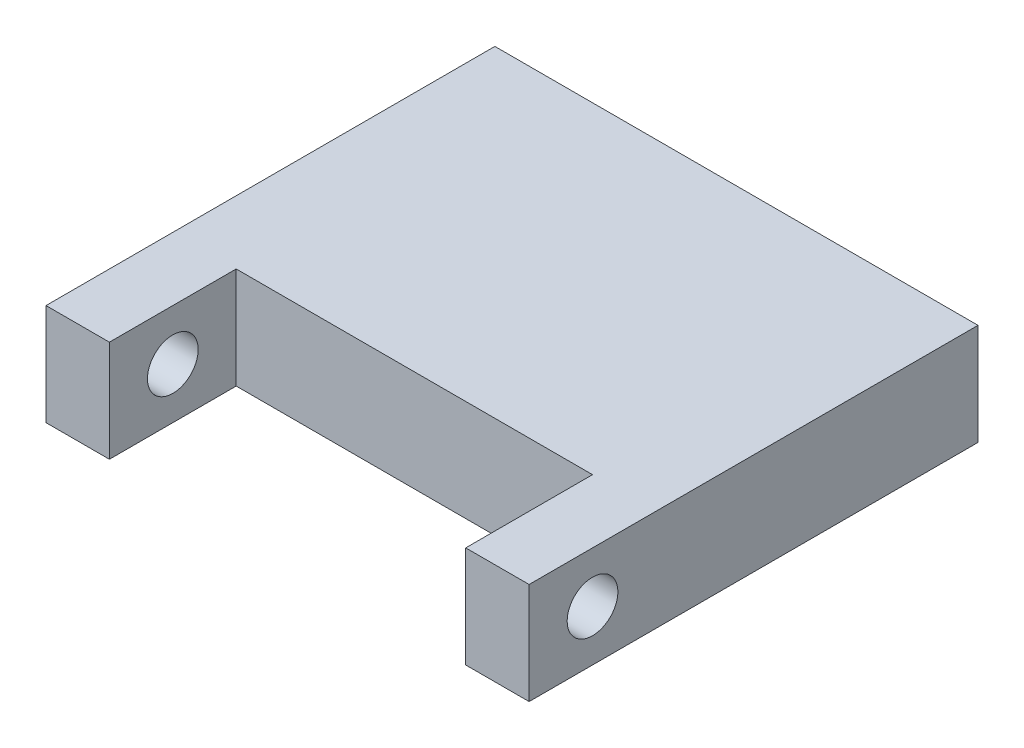
ISO-10303-21;
HEADER;
FILE_DESCRIPTION(('STEP AP214'),'2;1');
FILE_NAME('part.step','',(''),(''),'','','');
FILE_SCHEMA(('AUTOMOTIVE_DESIGN { 1 0 10303 214 1 1 1 1 }'));
ENDSEC;
DATA;
#1=APPLICATION_CONTEXT('core data for automotive mechanical design processes');
#2=APPLICATION_PROTOCOL_DEFINITION('international standard','automotive_design',2000,#1);
#3=PRODUCT_CONTEXT('',#1,'mechanical');
#4=PRODUCT('Part','Part','',(#3));
#5=PRODUCT_RELATED_PRODUCT_CATEGORY('part','',(#4));
#6=PRODUCT_DEFINITION_FORMATION('','',#4);
#7=PRODUCT_DEFINITION_CONTEXT('part definition',#1,'design');
#8=PRODUCT_DEFINITION('design','',#6,#7);
#9=PRODUCT_DEFINITION_SHAPE('','',#8);
#10=(LENGTH_UNIT() NAMED_UNIT(*) SI_UNIT(.MILLI.,.METRE.));
#11=(NAMED_UNIT(*) PLANE_ANGLE_UNIT() SI_UNIT($,.RADIAN.));
#12=(NAMED_UNIT(*) SI_UNIT($,.STERADIAN.) SOLID_ANGLE_UNIT());
#13=UNCERTAINTY_MEASURE_WITH_UNIT(LENGTH_MEASURE(1.E-05),#10,'distance_accuracy_value','');
#14=(GEOMETRIC_REPRESENTATION_CONTEXT(3) GLOBAL_UNCERTAINTY_ASSIGNED_CONTEXT((#13)) GLOBAL_UNIT_ASSIGNED_CONTEXT((#10,
#11,#12)) REPRESENTATION_CONTEXT('',''));
#15=CARTESIAN_POINT('',(0.,0.,0.));
#16=DIRECTION('',(0.,0.,1.));
#17=DIRECTION('',(1.,0.,0.));
#18=AXIS2_PLACEMENT_3D('',#15,#16,#17);
#19=CARTESIAN_POINT('',(0.,8.,0.));
#20=DIRECTION('',(0.,0.,-1.));
#21=DIRECTION('',(-1.,0.,0.));
#22=AXIS2_PLACEMENT_3D('',#19,#20,#21);
#23=PLANE('',#22);
#24=DIRECTION('',(0.,1.,0.));
#25=VECTOR('',#24,1.);
#26=CARTESIAN_POINT('',(5.,0.,0.));
#27=LINE('',#26,#25);
#28=CARTESIAN_POINT('',(5.,0.,0.));
#29=VERTEX_POINT('',#28);
#30=CARTESIAN_POINT('',(5.,8.,0.));
#31=VERTEX_POINT('',#30);
#32=EDGE_CURVE('E118',#29,#31,#27,.T.);
#33=ORIENTED_EDGE('',*,*,#32,.F.);
#34=DIRECTION('',(1.,0.,0.));
#35=VECTOR('',#34,1.);
#36=CARTESIAN_POINT('',(0.,0.,0.));
#37=LINE('',#36,#35);
#38=CARTESIAN_POINT('',(33.1,0.,0.));
#39=VERTEX_POINT('',#38);
#40=EDGE_CURVE('E160',#29,#39,#37,.T.);
#41=ORIENTED_EDGE('',*,*,#40,.T.);
#42=DIRECTION('',(0.,-1.,0.));
#43=VECTOR('',#42,1.);
#44=CARTESIAN_POINT('',(33.1,0.,0.));
#45=LINE('',#44,#43);
#46=CARTESIAN_POINT('',(33.1,8.,0.));
#47=VERTEX_POINT('',#46);
#48=EDGE_CURVE('E132',#47,#39,#45,.T.);
#49=ORIENTED_EDGE('',*,*,#48,.F.);
#50=DIRECTION('',(1.,0.,0.));
#51=VECTOR('',#50,1.);
#52=CARTESIAN_POINT('',(0.,8.,0.));
#53=LINE('',#52,#51);
#54=EDGE_CURVE('E50',#31,#47,#53,.T.);
#55=ORIENTED_EDGE('',*,*,#54,.F.);
#56=EDGE_LOOP('',(#33,#41,#49,#55));
#57=FACE_BOUND('',#56,.T.);
#58=ADVANCED_FACE('F34',(#57),#23,.F.);
#59=CARTESIAN_POINT('',(0.,8.,0.));
#60=DIRECTION('',(1.,0.,0.));
#61=DIRECTION('',(0.,0.,-1.));
#62=AXIS2_PLACEMENT_3D('',#59,#60,#61);
#63=PLANE('',#62);
#64=CARTESIAN_POINT('',(0.,4.,5.));
#65=DIRECTION('',(-1.,0.,0.));
#66=DIRECTION('',(0.,0.,1.));
#67=AXIS2_PLACEMENT_3D('',#64,#65,#66);
#68=CIRCLE('',#67,2.);
#69=CARTESIAN_POINT('',(0.,4.,7.));
#70=VERTEX_POINT('',#69);
#71=EDGE_CURVE('E177',#70,#70,#68,.T.);
#72=ORIENTED_EDGE('',*,*,#71,.F.);
#73=EDGE_LOOP('',(#72));
#74=FACE_BOUND('',#73,.T.);
#75=DIRECTION('',(0.,0.,1.));
#76=VECTOR('',#75,1.);
#77=CARTESIAN_POINT('',(0.,0.,0.));
#78=LINE('',#77,#76);
#79=CARTESIAN_POINT('',(0.,0.,-25.4));
#80=VERTEX_POINT('',#79);
#81=CARTESIAN_POINT('',(0.,0.,10.));
#82=VERTEX_POINT('',#81);
#83=EDGE_CURVE('E151',#80,#82,#78,.T.);
#84=ORIENTED_EDGE('',*,*,#83,.T.);
#85=DIRECTION('',(0.,-1.,0.));
#86=VECTOR('',#85,1.);
#87=CARTESIAN_POINT('',(0.,0.,10.));
#88=LINE('',#87,#86);
#89=CARTESIAN_POINT('',(0.,8.,10.));
#90=VERTEX_POINT('',#89);
#91=EDGE_CURVE('E108',#90,#82,#88,.T.);
#92=ORIENTED_EDGE('',*,*,#91,.F.);
#93=DIRECTION('',(0.,0.,1.));
#94=VECTOR('',#93,1.);
#95=CARTESIAN_POINT('',(0.,8.,0.));
#96=LINE('',#95,#94);
#97=CARTESIAN_POINT('',(0.,8.,-25.4));
#98=VERTEX_POINT('',#97);
#99=EDGE_CURVE('E104',#98,#90,#96,.T.);
#100=ORIENTED_EDGE('',*,*,#99,.F.);
#101=DIRECTION('',(0.,-1.,0.));
#102=VECTOR('',#101,1.);
#103=CARTESIAN_POINT('',(0.,8.,-25.4));
#104=LINE('',#103,#102);
#105=EDGE_CURVE('E43',#98,#80,#104,.T.);
#106=ORIENTED_EDGE('',*,*,#105,.T.);
#107=EDGE_LOOP('',(#84,#92,#100,#106));
#108=FACE_BOUND('',#107,.T.);
#109=ADVANCED_FACE('F36',(#74,#108),#63,.F.);
#110=CARTESIAN_POINT('',(38.1,8.,0.));
#111=DIRECTION('',(-1.,0.,0.));
#112=DIRECTION('',(0.,0.,1.));
#113=AXIS2_PLACEMENT_3D('',#110,#111,#112);
#114=PLANE('',#113);
#115=CARTESIAN_POINT('',(38.1,4.,5.));
#116=DIRECTION('',(-1.,0.,0.));
#117=DIRECTION('',(0.,0.,1.));
#118=AXIS2_PLACEMENT_3D('',#115,#116,#117);
#119=CIRCLE('',#118,2.);
#120=CARTESIAN_POINT('',(38.1,4.,7.));
#121=VERTEX_POINT('',#120);
#122=EDGE_CURVE('E125',#121,#121,#119,.T.);
#123=ORIENTED_EDGE('',*,*,#122,.T.);
#124=EDGE_LOOP('',(#123));
#125=FACE_BOUND('',#124,.T.);
#126=DIRECTION('',(0.,0.,-1.));
#127=VECTOR('',#126,1.);
#128=CARTESIAN_POINT('',(38.1,0.,0.));
#129=LINE('',#128,#127);
#130=CARTESIAN_POINT('',(38.1,0.,10.));
#131=VERTEX_POINT('',#130);
#132=CARTESIAN_POINT('',(38.1,0.,-25.4));
#133=VERTEX_POINT('',#132);
#134=EDGE_CURVE('E162',#131,#133,#129,.T.);
#135=ORIENTED_EDGE('',*,*,#134,.T.);
#136=DIRECTION('',(0.,-1.,0.));
#137=VECTOR('',#136,1.);
#138=CARTESIAN_POINT('',(38.1,8.,-25.4));
#139=LINE('',#138,#137);
#140=CARTESIAN_POINT('',(38.1,8.,-25.4));
#141=VERTEX_POINT('',#140);
#142=EDGE_CURVE('E11',#141,#133,#139,.T.);
#143=ORIENTED_EDGE('',*,*,#142,.F.);
#144=DIRECTION('',(0.,0.,-1.));
#145=VECTOR('',#144,1.);
#146=CARTESIAN_POINT('',(38.1,8.,0.));
#147=LINE('',#146,#145);
#148=CARTESIAN_POINT('',(38.1,8.,10.));
#149=VERTEX_POINT('',#148);
#150=EDGE_CURVE('E155',#149,#141,#147,.T.);
#151=ORIENTED_EDGE('',*,*,#150,.F.);
#152=DIRECTION('',(0.,1.,0.));
#153=VECTOR('',#152,1.);
#154=CARTESIAN_POINT('',(38.1,0.,10.));
#155=LINE('',#154,#153);
#156=EDGE_CURVE('E133',#131,#149,#155,.T.);
#157=ORIENTED_EDGE('',*,*,#156,.F.);
#158=EDGE_LOOP('',(#135,#143,#151,#157));
#159=FACE_BOUND('',#158,.T.);
#160=ADVANCED_FACE('F188',(#125,#159),#114,.F.);
#161=CARTESIAN_POINT('',(0.,8.,-25.4));
#162=DIRECTION('',(0.,0.,1.));
#163=DIRECTION('',(1.,0.,0.));
#164=AXIS2_PLACEMENT_3D('',#161,#162,#163);
#165=PLANE('',#164);
#166=DIRECTION('',(-1.,0.,0.));
#167=VECTOR('',#166,1.);
#168=CARTESIAN_POINT('',(0.,0.,-25.4));
#169=LINE('',#168,#167);
#170=EDGE_CURVE('E153',#133,#80,#169,.T.);
#171=ORIENTED_EDGE('',*,*,#170,.T.);
#172=ORIENTED_EDGE('',*,*,#105,.F.);
#173=DIRECTION('',(-1.,0.,0.));
#174=VECTOR('',#173,1.);
#175=CARTESIAN_POINT('',(0.,8.,-25.4));
#176=LINE('',#175,#174);
#177=EDGE_CURVE('E157',#141,#98,#176,.T.);
#178=ORIENTED_EDGE('',*,*,#177,.F.);
#179=ORIENTED_EDGE('',*,*,#142,.T.);
#180=EDGE_LOOP('',(#171,#172,#178,#179));
#181=FACE_BOUND('',#180,.T.);
#182=ADVANCED_FACE('F193',(#181),#165,.F.);
#183=CARTESIAN_POINT('',(0.,8.,0.));
#184=DIRECTION('',(0.,-1.,0.));
#185=DIRECTION('',(0.,0.,-1.));
#186=AXIS2_PLACEMENT_3D('',#183,#184,#185);
#187=PLANE('',#186);
#188=ORIENTED_EDGE('',*,*,#99,.T.);
#189=DIRECTION('',(-1.,0.,0.));
#190=VECTOR('',#189,1.);
#191=CARTESIAN_POINT('',(5.,8.,10.));
#192=LINE('',#191,#190);
#193=CARTESIAN_POINT('',(5.,8.,10.));
#194=VERTEX_POINT('',#193);
#195=EDGE_CURVE('E97',#194,#90,#192,.T.);
#196=ORIENTED_EDGE('',*,*,#195,.F.);
#197=DIRECTION('',(0.,0.,-1.));
#198=VECTOR('',#197,1.);
#199=CARTESIAN_POINT('',(5.,8.,10.));
#200=LINE('',#199,#198);
#201=EDGE_CURVE('E101',#194,#31,#200,.T.);
#202=ORIENTED_EDGE('',*,*,#201,.T.);
#203=ORIENTED_EDGE('',*,*,#54,.T.);
#204=DIRECTION('',(0.,0.,-1.));
#205=VECTOR('',#204,1.);
#206=CARTESIAN_POINT('',(33.1,8.,10.));
#207=LINE('',#206,#205);
#208=CARTESIAN_POINT('',(33.1,8.,10.));
#209=VERTEX_POINT('',#208);
#210=EDGE_CURVE('E148',#209,#47,#207,.T.);
#211=ORIENTED_EDGE('',*,*,#210,.F.);
#212=DIRECTION('',(-1.,0.,0.));
#213=VECTOR('',#212,1.);
#214=CARTESIAN_POINT('',(38.1,8.,10.));
#215=LINE('',#214,#213);
#216=EDGE_CURVE('E136',#149,#209,#215,.T.);
#217=ORIENTED_EDGE('',*,*,#216,.F.);
#218=ORIENTED_EDGE('',*,*,#150,.T.);
#219=ORIENTED_EDGE('',*,*,#177,.T.);
#220=EDGE_LOOP('',(#188,#196,#202,#203,#211,#217,#218,#219));
#221=FACE_BOUND('',#220,.T.);
#222=ADVANCED_FACE('F99',(#221),#187,.F.);
#223=CARTESIAN_POINT('',(0.,0.,0.));
#224=DIRECTION('',(0.,-1.,0.));
#225=DIRECTION('',(0.,0.,-1.));
#226=AXIS2_PLACEMENT_3D('',#223,#224,#225);
#227=PLANE('',#226);
#228=ORIENTED_EDGE('',*,*,#83,.F.);
#229=ORIENTED_EDGE('',*,*,#170,.F.);
#230=ORIENTED_EDGE('',*,*,#134,.F.);
#231=DIRECTION('',(1.,0.,0.));
#232=VECTOR('',#231,1.);
#233=CARTESIAN_POINT('',(38.1,0.,10.));
#234=LINE('',#233,#232);
#235=CARTESIAN_POINT('',(33.1,0.,10.));
#236=VERTEX_POINT('',#235);
#237=EDGE_CURVE('E140',#236,#131,#234,.T.);
#238=ORIENTED_EDGE('',*,*,#237,.F.);
#239=DIRECTION('',(0.,0.,-1.));
#240=VECTOR('',#239,1.);
#241=CARTESIAN_POINT('',(33.1,0.,10.));
#242=LINE('',#241,#240);
#243=EDGE_CURVE('E143',#236,#39,#242,.T.);
#244=ORIENTED_EDGE('',*,*,#243,.T.);
#245=ORIENTED_EDGE('',*,*,#40,.F.);
#246=DIRECTION('',(0.,0.,-1.));
#247=VECTOR('',#246,1.);
#248=CARTESIAN_POINT('',(5.,0.,10.));
#249=LINE('',#248,#247);
#250=CARTESIAN_POINT('',(5.,0.,10.));
#251=VERTEX_POINT('',#250);
#252=EDGE_CURVE('E122',#251,#29,#249,.T.);
#253=ORIENTED_EDGE('',*,*,#252,.F.);
#254=DIRECTION('',(1.,0.,0.));
#255=VECTOR('',#254,1.);
#256=CARTESIAN_POINT('',(5.,0.,10.));
#257=LINE('',#256,#255);
#258=EDGE_CURVE('E114',#82,#251,#257,.T.);
#259=ORIENTED_EDGE('',*,*,#258,.F.);
#260=EDGE_LOOP('',(#228,#229,#230,#238,#244,#245,#253,#259));
#261=FACE_BOUND('',#260,.T.);
#262=ADVANCED_FACE('F173',(#261),#227,.T.);
#263=CARTESIAN_POINT('',(33.1,0.,10.));
#264=DIRECTION('',(1.,0.,0.));
#265=DIRECTION('',(0.,0.,-1.));
#266=AXIS2_PLACEMENT_3D('',#263,#264,#265);
#267=PLANE('',#266);
#268=CARTESIAN_POINT('',(33.1,4.,5.));
#269=DIRECTION('',(-1.,0.,0.));
#270=DIRECTION('',(0.,0.,1.));
#271=AXIS2_PLACEMENT_3D('',#268,#269,#270);
#272=CIRCLE('',#271,2.);
#273=CARTESIAN_POINT('',(33.1,4.,7.));
#274=VERTEX_POINT('',#273);
#275=EDGE_CURVE('E121',#274,#274,#272,.T.);
#276=ORIENTED_EDGE('',*,*,#275,.F.);
#277=EDGE_LOOP('',(#276));
#278=FACE_BOUND('',#277,.T.);
#279=ORIENTED_EDGE('',*,*,#48,.T.);
#280=ORIENTED_EDGE('',*,*,#243,.F.);
#281=DIRECTION('',(0.,-1.,0.));
#282=VECTOR('',#281,1.);
#283=CARTESIAN_POINT('',(33.1,0.,10.));
#284=LINE('',#283,#282);
#285=EDGE_CURVE('E138',#209,#236,#284,.T.);
#286=ORIENTED_EDGE('',*,*,#285,.F.);
#287=ORIENTED_EDGE('',*,*,#210,.T.);
#288=EDGE_LOOP('',(#279,#280,#286,#287));
#289=FACE_BOUND('',#288,.T.);
#290=ADVANCED_FACE('F203',(#278,#289),#267,.F.);
#291=CARTESIAN_POINT('',(0.,0.,10.));
#292=DIRECTION('',(0.,0.,1.));
#293=DIRECTION('',(1.,0.,0.));
#294=AXIS2_PLACEMENT_3D('',#291,#292,#293);
#295=PLANE('',#294);
#296=ORIENTED_EDGE('',*,*,#156,.T.);
#297=ORIENTED_EDGE('',*,*,#216,.T.);
#298=ORIENTED_EDGE('',*,*,#285,.T.);
#299=ORIENTED_EDGE('',*,*,#237,.T.);
#300=EDGE_LOOP('',(#296,#297,#298,#299));
#301=FACE_BOUND('',#300,.T.);
#302=ADVANCED_FACE('F208',(#301),#295,.T.);
#303=CARTESIAN_POINT('',(63.1,4.,5.));
#304=DIRECTION('',(-1.,0.,0.));
#305=DIRECTION('',(0.,0.,1.));
#306=AXIS2_PLACEMENT_3D('',#303,#304,#305);
#307=CYLINDRICAL_SURFACE('',#306,2.);
#308=ORIENTED_EDGE('',*,*,#275,.T.);
#309=EDGE_LOOP('',(#308));
#310=FACE_BOUND('',#309,.T.);
#311=ORIENTED_EDGE('',*,*,#122,.F.);
#312=EDGE_LOOP('',(#311));
#313=FACE_BOUND('',#312,.T.);
#314=ADVANCED_FACE('F212',(#310,#313),#307,.F.);
#315=CARTESIAN_POINT('',(5.,0.,10.));
#316=DIRECTION('',(-1.,0.,0.));
#317=DIRECTION('',(0.,0.,1.));
#318=AXIS2_PLACEMENT_3D('',#315,#316,#317);
#319=PLANE('',#318);
#320=CARTESIAN_POINT('',(5.,4.,5.));
#321=DIRECTION('',(-1.,0.,0.));
#322=DIRECTION('',(0.,0.,1.));
#323=AXIS2_PLACEMENT_3D('',#320,#321,#322);
#324=CIRCLE('',#323,2.);
#325=CARTESIAN_POINT('',(5.,4.,7.));
#326=VERTEX_POINT('',#325);
#327=EDGE_CURVE('E38',#326,#326,#324,.T.);
#328=ORIENTED_EDGE('',*,*,#327,.T.);
#329=EDGE_LOOP('',(#328));
#330=FACE_BOUND('',#329,.T.);
#331=ORIENTED_EDGE('',*,*,#32,.T.);
#332=ORIENTED_EDGE('',*,*,#201,.F.);
#333=DIRECTION('',(0.,1.,0.));
#334=VECTOR('',#333,1.);
#335=CARTESIAN_POINT('',(5.,0.,10.));
#336=LINE('',#335,#334);
#337=EDGE_CURVE('E109',#251,#194,#336,.T.);
#338=ORIENTED_EDGE('',*,*,#337,.F.);
#339=ORIENTED_EDGE('',*,*,#252,.T.);
#340=EDGE_LOOP('',(#331,#332,#338,#339));
#341=FACE_BOUND('',#340,.T.);
#342=ADVANCED_FACE('F120',(#330,#341),#319,.F.);
#343=CARTESIAN_POINT('',(-33.1,0.,10.));
#344=DIRECTION('',(0.,0.,1.));
#345=DIRECTION('',(1.,0.,0.));
#346=AXIS2_PLACEMENT_3D('',#343,#344,#345);
#347=PLANE('',#346);
#348=ORIENTED_EDGE('',*,*,#337,.T.);
#349=ORIENTED_EDGE('',*,*,#195,.T.);
#350=ORIENTED_EDGE('',*,*,#91,.T.);
#351=ORIENTED_EDGE('',*,*,#258,.T.);
#352=EDGE_LOOP('',(#348,#349,#350,#351));
#353=FACE_BOUND('',#352,.T.);
#354=ADVANCED_FACE('F112',(#353),#347,.T.);
#355=CARTESIAN_POINT('',(30.,4.,5.));
#356=DIRECTION('',(-1.,0.,0.));
#357=DIRECTION('',(0.,0.,1.));
#358=AXIS2_PLACEMENT_3D('',#355,#356,#357);
#359=CYLINDRICAL_SURFACE('',#358,2.);
#360=ORIENTED_EDGE('',*,*,#71,.T.);
#361=EDGE_LOOP('',(#360));
#362=FACE_BOUND('',#361,.T.);
#363=ORIENTED_EDGE('',*,*,#327,.F.);
#364=EDGE_LOOP('',(#363));
#365=FACE_BOUND('',#364,.T.);
#366=ADVANCED_FACE('F184',(#362,#365),#359,.F.);
#367=CLOSED_SHELL('',(#58,#109,#160,#182,#222,#262,#290,#302,#314,#342,#354,#366));
#368=MANIFOLD_SOLID_BREP('B2',#367);
#369=ADVANCED_BREP_SHAPE_REPRESENTATION('',(#18,#368),#14);
#370=SHAPE_DEFINITION_REPRESENTATION(#9,#369);
ENDSEC;
END-ISO-10303-21;
